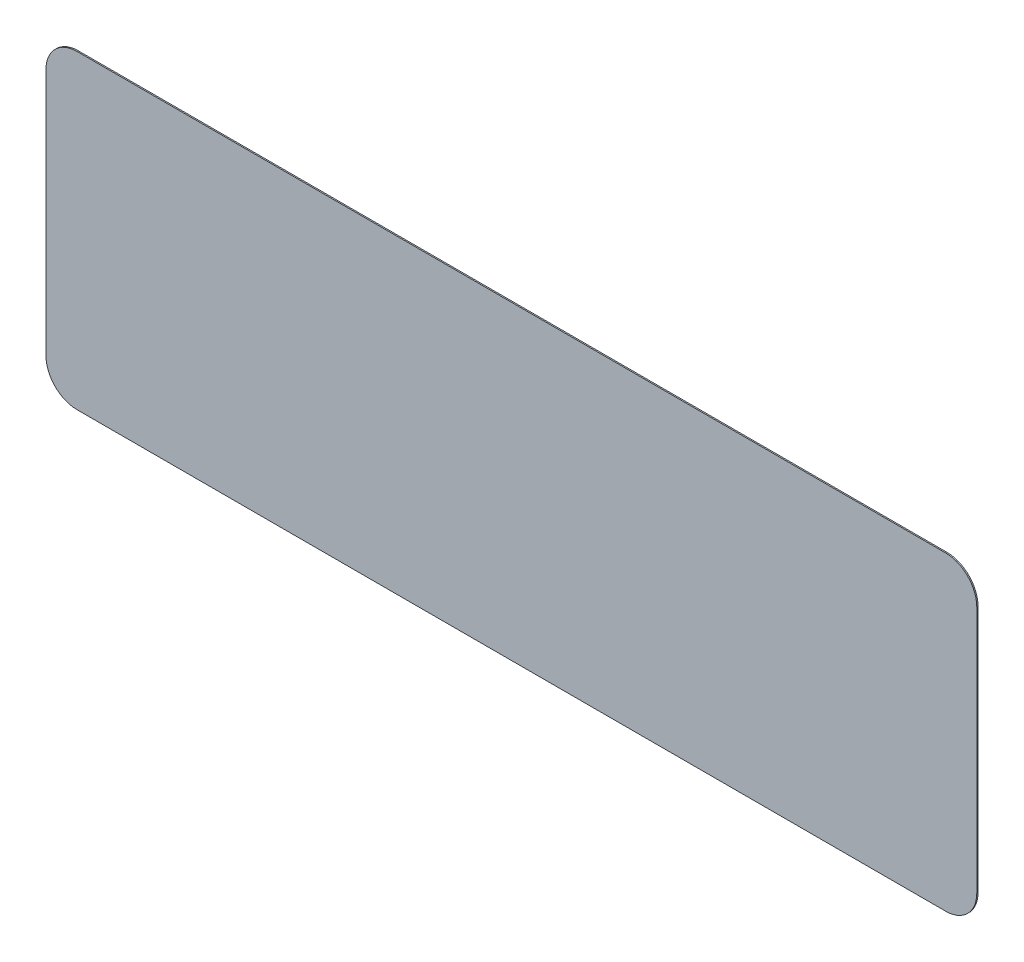
ISO-10303-21;
HEADER;
FILE_DESCRIPTION(('STEP AP214'),'2;1');
FILE_NAME('part.step','',(''),(''),'','','');
FILE_SCHEMA(('AUTOMOTIVE_DESIGN { 1 0 10303 214 1 1 1 1 }'));
ENDSEC;
DATA;
#1=APPLICATION_CONTEXT('core data for automotive mechanical design processes');
#2=APPLICATION_PROTOCOL_DEFINITION('international standard','automotive_design',2000,#1);
#3=PRODUCT_CONTEXT('',#1,'mechanical');
#4=PRODUCT('Part','Part','',(#3));
#5=PRODUCT_RELATED_PRODUCT_CATEGORY('part','',(#4));
#6=PRODUCT_DEFINITION_FORMATION('','',#4);
#7=PRODUCT_DEFINITION_CONTEXT('part definition',#1,'design');
#8=PRODUCT_DEFINITION('design','',#6,#7);
#9=PRODUCT_DEFINITION_SHAPE('','',#8);
#10=(LENGTH_UNIT() NAMED_UNIT(*) SI_UNIT(.MILLI.,.METRE.));
#11=(NAMED_UNIT(*) PLANE_ANGLE_UNIT() SI_UNIT($,.RADIAN.));
#12=(NAMED_UNIT(*) SI_UNIT($,.STERADIAN.) SOLID_ANGLE_UNIT());
#13=UNCERTAINTY_MEASURE_WITH_UNIT(LENGTH_MEASURE(1.E-05),#10,'distance_accuracy_value','');
#14=(GEOMETRIC_REPRESENTATION_CONTEXT(3) GLOBAL_UNCERTAINTY_ASSIGNED_CONTEXT((#13)) GLOBAL_UNIT_ASSIGNED_CONTEXT((#10,
#11,#12)) REPRESENTATION_CONTEXT('',''));
#15=CARTESIAN_POINT('',(0.,0.,0.));
#16=DIRECTION('',(0.,0.,1.));
#17=DIRECTION('',(1.,0.,0.));
#18=AXIS2_PLACEMENT_3D('',#15,#16,#17);
#19=CARTESIAN_POINT('',(-35.56,10.16,0.1016));
#20=DIRECTION('',(0.,0.,-1.));
#21=DIRECTION('',(-1.,0.,0.));
#22=AXIS2_PLACEMENT_3D('',#19,#20,#21);
#23=CYLINDRICAL_SURFACE('',#22,2.54);
#24=CARTESIAN_POINT('',(-35.56,10.16,0.));
#25=DIRECTION('',(0.,0.,1.));
#26=DIRECTION('',(1.,0.,0.));
#27=AXIS2_PLACEMENT_3D('',#24,#25,#26);
#28=CIRCLE('',#27,2.54);
#29=CARTESIAN_POINT('',(-35.56,12.7,0.));
#30=VERTEX_POINT('',#29);
#31=CARTESIAN_POINT('',(-38.1,10.16,0.));
#32=VERTEX_POINT('',#31);
#33=EDGE_CURVE('E133',#30,#32,#28,.T.);
#34=ORIENTED_EDGE('',*,*,#33,.T.);
#35=DIRECTION('',(0.,0.,-1.));
#36=VECTOR('',#35,1.);
#37=CARTESIAN_POINT('',(-38.1,10.16,0.1016));
#38=LINE('',#37,#36);
#39=CARTESIAN_POINT('',(-38.1,10.16,0.1016));
#40=VERTEX_POINT('',#39);
#41=EDGE_CURVE('E11',#40,#32,#38,.T.);
#42=ORIENTED_EDGE('',*,*,#41,.F.);
#43=CARTESIAN_POINT('',(-35.56,10.16,0.1016));
#44=DIRECTION('',(0.,0.,1.));
#45=DIRECTION('',(1.,0.,0.));
#46=AXIS2_PLACEMENT_3D('',#43,#44,#45);
#47=CIRCLE('',#46,2.54);
#48=CARTESIAN_POINT('',(-35.56,12.7,0.1016));
#49=VERTEX_POINT('',#48);
#50=EDGE_CURVE('E147',#49,#40,#47,.T.);
#51=ORIENTED_EDGE('',*,*,#50,.F.);
#52=DIRECTION('',(0.,0.,-1.));
#53=VECTOR('',#52,1.);
#54=CARTESIAN_POINT('',(-35.56,12.7,0.1016));
#55=LINE('',#54,#53);
#56=EDGE_CURVE('E129',#49,#30,#55,.T.);
#57=ORIENTED_EDGE('',*,*,#56,.T.);
#58=EDGE_LOOP('',(#34,#42,#51,#57));
#59=FACE_BOUND('',#58,.T.);
#60=ADVANCED_FACE('F37',(#59),#23,.T.);
#61=CARTESIAN_POINT('',(-38.1,10.16,0.1016));
#62=DIRECTION('',(1.,0.,0.));
#63=DIRECTION('',(0.,0.,-1.));
#64=AXIS2_PLACEMENT_3D('',#61,#62,#63);
#65=PLANE('',#64);
#66=DIRECTION('',(0.,-1.,0.));
#67=VECTOR('',#66,1.);
#68=CARTESIAN_POINT('',(-38.1,10.16,0.));
#69=LINE('',#68,#67);
#70=CARTESIAN_POINT('',(-38.1,-10.16,0.));
#71=VERTEX_POINT('',#70);
#72=EDGE_CURVE('E136',#32,#71,#69,.T.);
#73=ORIENTED_EDGE('',*,*,#72,.T.);
#74=DIRECTION('',(0.,0.,-1.));
#75=VECTOR('',#74,1.);
#76=CARTESIAN_POINT('',(-38.1,-10.16,0.1016));
#77=LINE('',#76,#75);
#78=CARTESIAN_POINT('',(-38.1,-10.16,0.1016));
#79=VERTEX_POINT('',#78);
#80=EDGE_CURVE('E45',#79,#71,#77,.T.);
#81=ORIENTED_EDGE('',*,*,#80,.F.);
#82=DIRECTION('',(0.,-1.,0.));
#83=VECTOR('',#82,1.);
#84=CARTESIAN_POINT('',(-38.1,10.16,0.1016));
#85=LINE('',#84,#83);
#86=EDGE_CURVE('E96',#40,#79,#85,.T.);
#87=ORIENTED_EDGE('',*,*,#86,.F.);
#88=ORIENTED_EDGE('',*,*,#41,.T.);
#89=EDGE_LOOP('',(#73,#81,#87,#88));
#90=FACE_BOUND('',#89,.T.);
#91=ADVANCED_FACE('F182',(#90),#65,.F.);
#92=CARTESIAN_POINT('',(-35.56,-10.16,0.1016));
#93=DIRECTION('',(0.,0.,-1.));
#94=DIRECTION('',(-1.,0.,0.));
#95=AXIS2_PLACEMENT_3D('',#92,#93,#94);
#96=CYLINDRICAL_SURFACE('',#95,2.54);
#97=CARTESIAN_POINT('',(-35.56,-10.16,0.));
#98=DIRECTION('',(0.,0.,1.));
#99=DIRECTION('',(-1.,0.,0.));
#100=AXIS2_PLACEMENT_3D('',#97,#98,#99);
#101=CIRCLE('',#100,2.54);
#102=CARTESIAN_POINT('',(-35.56,-12.7,0.));
#103=VERTEX_POINT('',#102);
#104=EDGE_CURVE('E138',#71,#103,#101,.T.);
#105=ORIENTED_EDGE('',*,*,#104,.T.);
#106=DIRECTION('',(0.,0.,-1.));
#107=VECTOR('',#106,1.);
#108=CARTESIAN_POINT('',(-35.56,-12.7,0.1016));
#109=LINE('',#108,#107);
#110=CARTESIAN_POINT('',(-35.56,-12.7,0.1016));
#111=VERTEX_POINT('',#110);
#112=EDGE_CURVE('E154',#111,#103,#109,.T.);
#113=ORIENTED_EDGE('',*,*,#112,.F.);
#114=CARTESIAN_POINT('',(-35.56,-10.16,0.1016));
#115=DIRECTION('',(0.,0.,1.));
#116=DIRECTION('',(-1.,0.,0.));
#117=AXIS2_PLACEMENT_3D('',#114,#115,#116);
#118=CIRCLE('',#117,2.54);
#119=EDGE_CURVE('E162',#79,#111,#118,.T.);
#120=ORIENTED_EDGE('',*,*,#119,.F.);
#121=ORIENTED_EDGE('',*,*,#80,.T.);
#122=EDGE_LOOP('',(#105,#113,#120,#121));
#123=FACE_BOUND('',#122,.T.);
#124=ADVANCED_FACE('F160',(#123),#96,.T.);
#125=CARTESIAN_POINT('',(35.56,-12.7,0.1016));
#126=DIRECTION('',(0.,1.,0.));
#127=DIRECTION('',(-1.,0.,0.));
#128=AXIS2_PLACEMENT_3D('',#125,#126,#127);
#129=PLANE('',#128);
#130=DIRECTION('',(1.,0.,0.));
#131=VECTOR('',#130,1.);
#132=CARTESIAN_POINT('',(35.56,-12.7,0.));
#133=LINE('',#132,#131);
#134=CARTESIAN_POINT('',(35.56,-12.7,0.));
#135=VERTEX_POINT('',#134);
#136=EDGE_CURVE('E140',#103,#135,#133,.T.);
#137=ORIENTED_EDGE('',*,*,#136,.T.);
#138=DIRECTION('',(0.,0.,-1.));
#139=VECTOR('',#138,1.);
#140=CARTESIAN_POINT('',(35.56,-12.7,0.1016));
#141=LINE('',#140,#139);
#142=CARTESIAN_POINT('',(35.56,-12.7,0.1016));
#143=VERTEX_POINT('',#142);
#144=EDGE_CURVE('E151',#143,#135,#141,.T.);
#145=ORIENTED_EDGE('',*,*,#144,.F.);
#146=DIRECTION('',(1.,0.,0.));
#147=VECTOR('',#146,1.);
#148=CARTESIAN_POINT('',(35.56,-12.7,0.1016));
#149=LINE('',#148,#147);
#150=EDGE_CURVE('E174',#111,#143,#149,.T.);
#151=ORIENTED_EDGE('',*,*,#150,.F.);
#152=ORIENTED_EDGE('',*,*,#112,.T.);
#153=EDGE_LOOP('',(#137,#145,#151,#152));
#154=FACE_BOUND('',#153,.T.);
#155=ADVANCED_FACE('F170',(#154),#129,.F.);
#156=CARTESIAN_POINT('',(35.56,-10.16,0.1016));
#157=DIRECTION('',(0.,0.,-1.));
#158=DIRECTION('',(-1.,0.,0.));
#159=AXIS2_PLACEMENT_3D('',#156,#157,#158);
#160=CYLINDRICAL_SURFACE('',#159,2.54);
#161=CARTESIAN_POINT('',(35.56,-10.16,0.));
#162=DIRECTION('',(0.,0.,1.));
#163=DIRECTION('',(-1.,0.,0.));
#164=AXIS2_PLACEMENT_3D('',#161,#162,#163);
#165=CIRCLE('',#164,2.54);
#166=CARTESIAN_POINT('',(38.1,-10.16,0.));
#167=VERTEX_POINT('',#166);
#168=EDGE_CURVE('E142',#135,#167,#165,.T.);
#169=ORIENTED_EDGE('',*,*,#168,.T.);
#170=DIRECTION('',(0.,0.,-1.));
#171=VECTOR('',#170,1.);
#172=CARTESIAN_POINT('',(38.1,-10.16,0.1016));
#173=LINE('',#172,#171);
#174=CARTESIAN_POINT('',(38.1,-10.16,0.1016));
#175=VERTEX_POINT('',#174);
#176=EDGE_CURVE('E124',#175,#167,#173,.T.);
#177=ORIENTED_EDGE('',*,*,#176,.F.);
#178=CARTESIAN_POINT('',(35.56,-10.16,0.1016));
#179=DIRECTION('',(0.,0.,1.));
#180=DIRECTION('',(-1.,0.,0.));
#181=AXIS2_PLACEMENT_3D('',#178,#179,#180);
#182=CIRCLE('',#181,2.54);
#183=EDGE_CURVE('E115',#143,#175,#182,.T.);
#184=ORIENTED_EDGE('',*,*,#183,.F.);
#185=ORIENTED_EDGE('',*,*,#144,.T.);
#186=EDGE_LOOP('',(#169,#177,#184,#185));
#187=FACE_BOUND('',#186,.T.);
#188=ADVANCED_FACE('F173',(#187),#160,.T.);
#189=CARTESIAN_POINT('',(38.1,10.16,0.1016));
#190=DIRECTION('',(-1.,0.,0.));
#191=DIRECTION('',(0.,0.,1.));
#192=AXIS2_PLACEMENT_3D('',#189,#190,#191);
#193=PLANE('',#192);
#194=DIRECTION('',(0.,1.,0.));
#195=VECTOR('',#194,1.);
#196=CARTESIAN_POINT('',(38.1,10.16,0.));
#197=LINE('',#196,#195);
#198=CARTESIAN_POINT('',(38.1,10.16,0.));
#199=VERTEX_POINT('',#198);
#200=EDGE_CURVE('E123',#167,#199,#197,.T.);
#201=ORIENTED_EDGE('',*,*,#200,.T.);
#202=DIRECTION('',(0.,0.,-1.));
#203=VECTOR('',#202,1.);
#204=CARTESIAN_POINT('',(38.1,10.16,0.1016));
#205=LINE('',#204,#203);
#206=CARTESIAN_POINT('',(38.1,10.16,0.1016));
#207=VERTEX_POINT('',#206);
#208=EDGE_CURVE('E120',#207,#199,#205,.T.);
#209=ORIENTED_EDGE('',*,*,#208,.F.);
#210=DIRECTION('',(0.,1.,0.));
#211=VECTOR('',#210,1.);
#212=CARTESIAN_POINT('',(38.1,10.16,0.1016));
#213=LINE('',#212,#211);
#214=EDGE_CURVE('E109',#175,#207,#213,.T.);
#215=ORIENTED_EDGE('',*,*,#214,.F.);
#216=ORIENTED_EDGE('',*,*,#176,.T.);
#217=EDGE_LOOP('',(#201,#209,#215,#216));
#218=FACE_BOUND('',#217,.T.);
#219=ADVANCED_FACE('F121',(#218),#193,.F.);
#220=CARTESIAN_POINT('',(35.56,10.16,0.1016));
#221=DIRECTION('',(0.,0.,-1.));
#222=DIRECTION('',(-1.,0.,0.));
#223=AXIS2_PLACEMENT_3D('',#220,#221,#222);
#224=CYLINDRICAL_SURFACE('',#223,2.54);
#225=CARTESIAN_POINT('',(35.56,10.16,0.));
#226=DIRECTION('',(0.,0.,1.));
#227=DIRECTION('',(-1.,0.,0.));
#228=AXIS2_PLACEMENT_3D('',#225,#226,#227);
#229=CIRCLE('',#228,2.54);
#230=CARTESIAN_POINT('',(35.56,12.7,0.));
#231=VERTEX_POINT('',#230);
#232=EDGE_CURVE('E82',#199,#231,#229,.T.);
#233=ORIENTED_EDGE('',*,*,#232,.T.);
#234=DIRECTION('',(0.,0.,-1.));
#235=VECTOR('',#234,1.);
#236=CARTESIAN_POINT('',(35.56,12.7,0.1016));
#237=LINE('',#236,#235);
#238=CARTESIAN_POINT('',(35.56,12.7,0.1016));
#239=VERTEX_POINT('',#238);
#240=EDGE_CURVE('E125',#239,#231,#237,.T.);
#241=ORIENTED_EDGE('',*,*,#240,.F.);
#242=CARTESIAN_POINT('',(35.56,10.16,0.1016));
#243=DIRECTION('',(0.,0.,1.));
#244=DIRECTION('',(-1.,0.,0.));
#245=AXIS2_PLACEMENT_3D('',#242,#243,#244);
#246=CIRCLE('',#245,2.54);
#247=EDGE_CURVE('E113',#207,#239,#246,.T.);
#248=ORIENTED_EDGE('',*,*,#247,.F.);
#249=ORIENTED_EDGE('',*,*,#208,.T.);
#250=EDGE_LOOP('',(#233,#241,#248,#249));
#251=FACE_BOUND('',#250,.T.);
#252=ADVANCED_FACE('F127',(#251),#224,.T.);
#253=CARTESIAN_POINT('',(35.56,12.7,0.1016));
#254=DIRECTION('',(0.,-1.,0.));
#255=DIRECTION('',(1.,0.,0.));
#256=AXIS2_PLACEMENT_3D('',#253,#254,#255);
#257=PLANE('',#256);
#258=DIRECTION('',(-1.,0.,0.));
#259=VECTOR('',#258,1.);
#260=CARTESIAN_POINT('',(35.56,12.7,0.));
#261=LINE('',#260,#259);
#262=EDGE_CURVE('E88',#231,#30,#261,.T.);
#263=ORIENTED_EDGE('',*,*,#262,.T.);
#264=ORIENTED_EDGE('',*,*,#56,.F.);
#265=DIRECTION('',(-1.,0.,0.));
#266=VECTOR('',#265,1.);
#267=CARTESIAN_POINT('',(35.56,12.7,0.1016));
#268=LINE('',#267,#266);
#269=EDGE_CURVE('E53',#239,#49,#268,.T.);
#270=ORIENTED_EDGE('',*,*,#269,.F.);
#271=ORIENTED_EDGE('',*,*,#240,.T.);
#272=EDGE_LOOP('',(#263,#264,#270,#271));
#273=FACE_BOUND('',#272,.T.);
#274=ADVANCED_FACE('F198',(#273),#257,.F.);
#275=CARTESIAN_POINT('',(-35.56,10.16,0.1016));
#276=DIRECTION('',(0.,0.,1.));
#277=DIRECTION('',(1.,0.,0.));
#278=AXIS2_PLACEMENT_3D('',#275,#276,#277);
#279=PLANE('',#278);
#280=ORIENTED_EDGE('',*,*,#50,.T.);
#281=ORIENTED_EDGE('',*,*,#86,.T.);
#282=ORIENTED_EDGE('',*,*,#119,.T.);
#283=ORIENTED_EDGE('',*,*,#150,.T.);
#284=ORIENTED_EDGE('',*,*,#183,.T.);
#285=ORIENTED_EDGE('',*,*,#214,.T.);
#286=ORIENTED_EDGE('',*,*,#247,.T.);
#287=ORIENTED_EDGE('',*,*,#269,.T.);
#288=EDGE_LOOP('',(#280,#281,#282,#283,#284,#285,#286,#287));
#289=FACE_BOUND('',#288,.T.);
#290=ADVANCED_FACE('F111',(#289),#279,.T.);
#291=CARTESIAN_POINT('',(-35.56,10.16,0.));
#292=DIRECTION('',(0.,0.,1.));
#293=DIRECTION('',(1.,0.,0.));
#294=AXIS2_PLACEMENT_3D('',#291,#292,#293);
#295=PLANE('',#294);
#296=ORIENTED_EDGE('',*,*,#33,.F.);
#297=ORIENTED_EDGE('',*,*,#262,.F.);
#298=ORIENTED_EDGE('',*,*,#232,.F.);
#299=ORIENTED_EDGE('',*,*,#200,.F.);
#300=ORIENTED_EDGE('',*,*,#168,.F.);
#301=ORIENTED_EDGE('',*,*,#136,.F.);
#302=ORIENTED_EDGE('',*,*,#104,.F.);
#303=ORIENTED_EDGE('',*,*,#72,.F.);
#304=EDGE_LOOP('',(#296,#297,#298,#299,#300,#301,#302,#303));
#305=FACE_BOUND('',#304,.T.);
#306=ADVANCED_FACE('F166',(#305),#295,.F.);
#307=CLOSED_SHELL('',(#60,#91,#124,#155,#188,#219,#252,#274,#290,#306));
#308=MANIFOLD_SOLID_BREP('B2',#307);
#309=ADVANCED_BREP_SHAPE_REPRESENTATION('',(#18,#308),#14);
#310=SHAPE_DEFINITION_REPRESENTATION(#9,#309);
ENDSEC;
END-ISO-10303-21;
